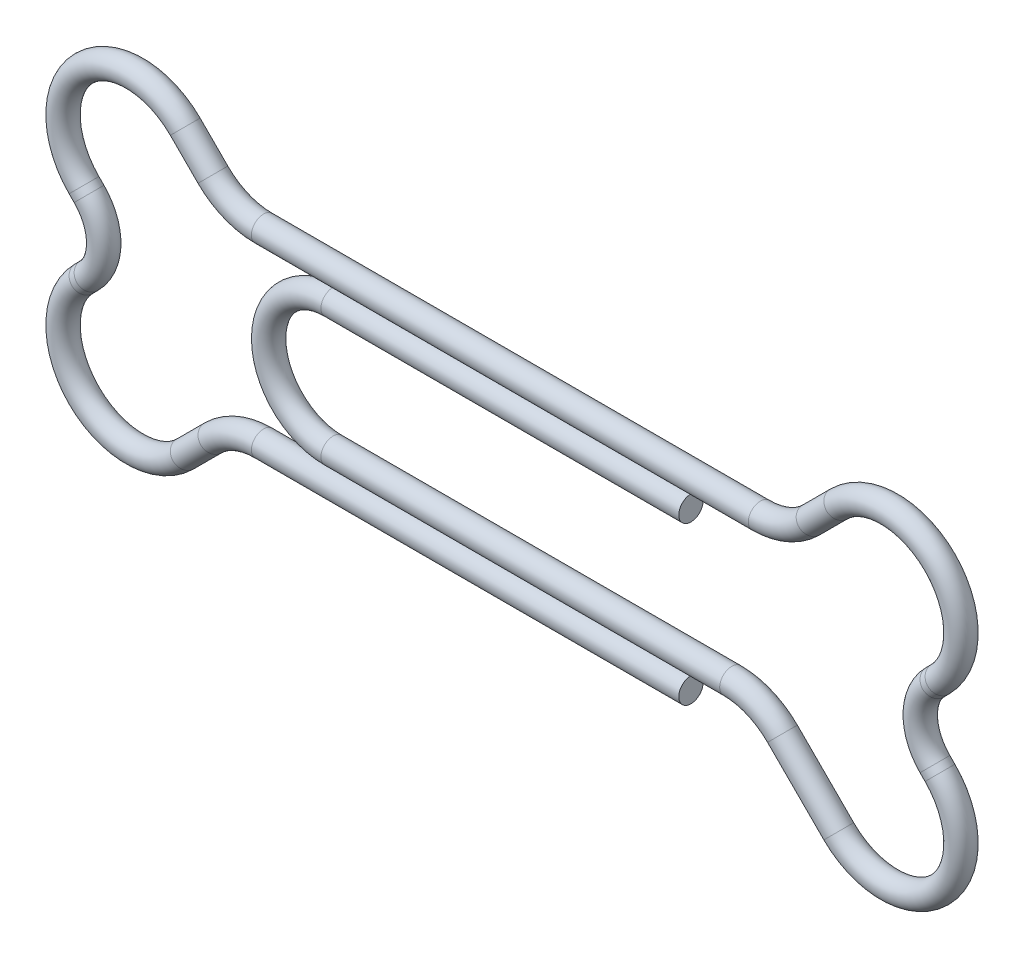
ISO-10303-21;
HEADER;
FILE_DESCRIPTION(('STEP AP214'),'2;1');
FILE_NAME('part.step','',(''),(''),'','','');
FILE_SCHEMA(('AUTOMOTIVE_DESIGN { 1 0 10303 214 1 1 1 1 }'));
ENDSEC;
DATA;
#1=APPLICATION_CONTEXT('core data for automotive mechanical design processes');
#2=APPLICATION_PROTOCOL_DEFINITION('international standard','automotive_design',2000,#1);
#3=PRODUCT_CONTEXT('',#1,'mechanical');
#4=PRODUCT('Part','Part','',(#3));
#5=PRODUCT_RELATED_PRODUCT_CATEGORY('part','',(#4));
#6=PRODUCT_DEFINITION_FORMATION('','',#4);
#7=PRODUCT_DEFINITION_CONTEXT('part definition',#1,'design');
#8=PRODUCT_DEFINITION('design','',#6,#7);
#9=PRODUCT_DEFINITION_SHAPE('','',#8);
#10=(LENGTH_UNIT() NAMED_UNIT(*) SI_UNIT(.MILLI.,.METRE.));
#11=(NAMED_UNIT(*) PLANE_ANGLE_UNIT() SI_UNIT($,.RADIAN.));
#12=(NAMED_UNIT(*) SI_UNIT($,.STERADIAN.) SOLID_ANGLE_UNIT());
#13=UNCERTAINTY_MEASURE_WITH_UNIT(LENGTH_MEASURE(1.E-05),#10,'distance_accuracy_value','');
#14=(GEOMETRIC_REPRESENTATION_CONTEXT(3) GLOBAL_UNCERTAINTY_ASSIGNED_CONTEXT((#13)) GLOBAL_UNIT_ASSIGNED_CONTEXT((#10,
#11,#12)) REPRESENTATION_CONTEXT('',''));
#15=CARTESIAN_POINT('',(0.,0.,0.));
#16=DIRECTION('',(0.,0.,1.));
#17=DIRECTION('',(1.,0.,0.));
#18=AXIS2_PLACEMENT_3D('',#15,#16,#17);
#19=CARTESIAN_POINT('',(1.52104574826343E-13,4.49999999999999,0.));
#20=DIRECTION('',(1.,0.,0.));
#21=DIRECTION('',(0.,0.,-1.));
#22=AXIS2_PLACEMENT_3D('',#19,#20,#21);
#23=CYLINDRICAL_SURFACE('',#22,0.85);
#24=CARTESIAN_POINT('',(1.52104574826343E-13,4.49999999999999,0.));
#25=DIRECTION('',(-1.,0.,0.));
#26=DIRECTION('',(0.,-1.,0.));
#27=AXIS2_PLACEMENT_3D('',#24,#25,#26);
#28=CIRCLE('',#27,0.85);
#29=CARTESIAN_POINT('',(1.80835438960207E-13,5.34999999999999,0.));
#30=VERTEX_POINT('',#29);
#31=EDGE_CURVE('E39',#30,#30,#28,.T.);
#32=ORIENTED_EDGE('',*,*,#31,.F.);
#33=EDGE_LOOP('',(#32));
#34=FACE_BOUND('',#33,.T.);
#35=CARTESIAN_POINT('',(25.0000000000001,4.49999999999999,0.));
#36=DIRECTION('',(-1.,0.,0.));
#37=DIRECTION('',(0.,-1.,0.));
#38=AXIS2_PLACEMENT_3D('',#35,#36,#37);
#39=CIRCLE('',#38,0.85);
#40=CARTESIAN_POINT('',(25.0000000000002,3.64999999999999,0.));
#41=VERTEX_POINT('',#40);
#42=EDGE_CURVE('E10',#41,#41,#39,.T.);
#43=ORIENTED_EDGE('',*,*,#42,.T.);
#44=EDGE_LOOP('',(#43));
#45=FACE_BOUND('',#44,.T.);
#46=ADVANCED_FACE('F33',(#34,#45),#23,.T.);
#47=CARTESIAN_POINT('',(0.,0.,0.));
#48=DIRECTION('',(0.,0.,-1.));
#49=DIRECTION('',(-1.,0.,0.));
#50=AXIS2_PLACEMENT_3D('',#47,#48,#49);
#51=TOROIDAL_SURFACE('',#50,4.49999999999999,0.85);
#52=CARTESIAN_POINT('',(-1.52655665885959E-13,-4.49999999999999,0.));
#53=DIRECTION('',(1.,0.,0.));
#54=DIRECTION('',(0.,1.,0.));
#55=AXIS2_PLACEMENT_3D('',#52,#53,#54);
#56=CIRCLE('',#55,0.85);
#57=CARTESIAN_POINT('',(-1.81490624997751E-13,-5.34999999999999,0.));
#58=VERTEX_POINT('',#57);
#59=EDGE_CURVE('E43',#58,#58,#56,.T.);
#60=CARTESIAN_POINT('',(0.,0.,0.));
#61=DIRECTION('',(0.,0.,-1.));
#62=DIRECTION('',(-1.,0.,0.));
#63=AXIS2_PLACEMENT_3D('',#60,#61,#62);
#64=CIRCLE('',#63,5.34999999999999);
#65=EDGE_CURVE('',#58,#30,#64,.T.);
#66=ORIENTED_EDGE('',*,*,#59,.F.);
#67=ORIENTED_EDGE('',*,*,#31,.T.);
#68=ORIENTED_EDGE('',*,*,#65,.T.);
#69=ORIENTED_EDGE('',*,*,#65,.F.);
#70=EDGE_LOOP('',(#66,#68,#67,#69));
#71=FACE_BOUND('',#70,.T.);
#72=ADVANCED_FACE('F233',(#71),#51,.T.);
#73=CARTESIAN_POINT('',(27.8578643762689,-4.49999999999999,0.));
#74=DIRECTION('',(-1.,0.,0.));
#75=DIRECTION('',(0.,0.,1.));
#76=AXIS2_PLACEMENT_3D('',#73,#74,#75);
#77=CYLINDRICAL_SURFACE('',#76,0.85);
#78=CARTESIAN_POINT('',(27.8578643762689,-4.49999999999999,0.));
#79=DIRECTION('',(1.,0.,0.));
#80=DIRECTION('',(0.,1.,0.));
#81=AXIS2_PLACEMENT_3D('',#78,#79,#80);
#82=CIRCLE('',#81,0.85);
#83=CARTESIAN_POINT('',(27.8578643762688,-3.65,0.));
#84=VERTEX_POINT('',#83);
#85=EDGE_CURVE('E47',#84,#84,#82,.T.);
#86=ORIENTED_EDGE('',*,*,#85,.F.);
#87=EDGE_LOOP('',(#86));
#88=FACE_BOUND('',#87,.T.);
#89=ORIENTED_EDGE('',*,*,#59,.T.);
#90=EDGE_LOOP('',(#89));
#91=FACE_BOUND('',#90,.T.);
#92=ADVANCED_FACE('F227',(#88,#91),#77,.T.);
#93=CARTESIAN_POINT('',(27.857864376269,-9.5,0.));
#94=DIRECTION('',(0.,0.,1.));
#95=DIRECTION('',(1.,0.,0.));
#96=AXIS2_PLACEMENT_3D('',#93,#94,#95);
#97=TOROIDAL_SURFACE('',#96,5.,0.85);
#98=CARTESIAN_POINT('',(31.3933982822017,-5.96446609406717,0.));
#99=DIRECTION('',(0.707106781186563,-0.707106781186532,0.));
#100=DIRECTION('',(0.707106781186532,0.707106781186563,0.));
#101=AXIS2_PLACEMENT_3D('',#98,#99,#100);
#102=CIRCLE('',#101,0.85);
#103=CARTESIAN_POINT('',(31.9944390462102,-5.36342533005859,0.));
#104=VERTEX_POINT('',#103);
#105=EDGE_CURVE('E52',#104,#104,#102,.T.);
#106=CARTESIAN_POINT('',(27.857864376269,-9.5,0.));
#107=DIRECTION('',(0.,0.,1.));
#108=DIRECTION('',(1.,0.,0.));
#109=AXIS2_PLACEMENT_3D('',#106,#107,#108);
#110=CIRCLE('',#109,5.85);
#111=EDGE_CURVE('',#104,#84,#110,.T.);
#112=ORIENTED_EDGE('',*,*,#105,.F.);
#113=ORIENTED_EDGE('',*,*,#85,.T.);
#114=ORIENTED_EDGE('',*,*,#111,.T.);
#115=ORIENTED_EDGE('',*,*,#111,.F.);
#116=EDGE_LOOP('',(#112,#114,#113,#115));
#117=FACE_BOUND('',#116,.T.);
#118=ADVANCED_FACE('F221',(#117),#97,.T.);
#119=CARTESIAN_POINT('',(35.3284271247461,-9.89949493661157,0.));
#120=DIRECTION('',(-0.707106781186547,0.707106781186548,0.));
#121=DIRECTION('',(-0.707106781186548,-0.707106781186547,0.));
#122=AXIS2_PLACEMENT_3D('',#119,#120,#121);
#123=CYLINDRICAL_SURFACE('',#122,0.85);
#124=CARTESIAN_POINT('',(35.3284271247461,-9.89949493661157,0.));
#125=DIRECTION('',(0.707106781186563,-0.707106781186532,0.));
#126=DIRECTION('',(0.707106781186532,0.707106781186563,0.));
#127=AXIS2_PLACEMENT_3D('',#124,#125,#126);
#128=CIRCLE('',#127,0.85);
#129=CARTESIAN_POINT('',(34.7273863607375,-10.5005357006201,0.));
#130=VERTEX_POINT('',#129);
#131=EDGE_CURVE('E55',#130,#130,#128,.T.);
#132=ORIENTED_EDGE('',*,*,#131,.F.);
#133=EDGE_LOOP('',(#132));
#134=FACE_BOUND('',#133,.T.);
#135=ORIENTED_EDGE('',*,*,#105,.T.);
#136=EDGE_LOOP('',(#135));
#137=FACE_BOUND('',#136,.T.);
#138=ADVANCED_FACE('F215',(#134,#137),#123,.T.);
#139=CARTESIAN_POINT('',(38.8639610306789,-6.36396103067894,0.));
#140=DIRECTION('',(0.,0.,-1.));
#141=DIRECTION('',(-1.,0.,0.));
#142=AXIS2_PLACEMENT_3D('',#139,#140,#141);
#143=TOROIDAL_SURFACE('',#142,4.99999999999999,0.85);
#144=CARTESIAN_POINT('',(42.3994949366118,-2.82842712474632,0.));
#145=DIRECTION('',(-0.707106781186563,0.707106781186532,0.));
#146=DIRECTION('',(-0.707106781186532,-0.707106781186563,0.));
#147=AXIS2_PLACEMENT_3D('',#144,#145,#146);
#148=CIRCLE('',#147,0.85);
#149=CARTESIAN_POINT('',(43.0005357006203,-2.22738636073777,0.));
#150=VERTEX_POINT('',#149);
#151=EDGE_CURVE('E58',#150,#150,#148,.T.);
#152=CARTESIAN_POINT('',(38.8639610306789,-6.36396103067894,0.));
#153=DIRECTION('',(0.,0.,-1.));
#154=DIRECTION('',(-1.,0.,0.));
#155=AXIS2_PLACEMENT_3D('',#152,#153,#154);
#156=CIRCLE('',#155,5.84999999999999);
#157=EDGE_CURVE('',#150,#130,#156,.T.);
#158=ORIENTED_EDGE('',*,*,#151,.F.);
#159=ORIENTED_EDGE('',*,*,#131,.T.);
#160=ORIENTED_EDGE('',*,*,#157,.T.);
#161=ORIENTED_EDGE('',*,*,#157,.F.);
#162=EDGE_LOOP('',(#158,#160,#159,#161));
#163=FACE_BOUND('',#162,.T.);
#164=ADVANCED_FACE('F209',(#163),#143,.T.);
#165=CARTESIAN_POINT('',(42.0459415460185,-2.47487373415304,0.));
#166=DIRECTION('',(0.70710678118655,-0.707106781186545,0.));
#167=DIRECTION('',(0.707106781186545,0.70710678118655,0.));
#168=AXIS2_PLACEMENT_3D('',#165,#166,#167);
#169=CYLINDRICAL_SURFACE('',#168,0.85);
#170=CARTESIAN_POINT('',(42.0459415460185,-2.47487373415304,0.));
#171=DIRECTION('',(-0.707106781186563,0.707106781186532,0.));
#172=DIRECTION('',(-0.707106781186532,-0.707106781186563,0.));
#173=AXIS2_PLACEMENT_3D('',#170,#171,#172);
#174=CIRCLE('',#173,0.85);
#175=CARTESIAN_POINT('',(41.44490078201,-3.07591449816164,0.));
#176=VERTEX_POINT('',#175);
#177=EDGE_CURVE('E61',#176,#176,#174,.T.);
#178=ORIENTED_EDGE('',*,*,#177,.F.);
#179=EDGE_LOOP('',(#178));
#180=FACE_BOUND('',#179,.T.);
#181=ORIENTED_EDGE('',*,*,#151,.T.);
#182=EDGE_LOOP('',(#181));
#183=FACE_BOUND('',#182,.T.);
#184=ADVANCED_FACE('F203',(#180,#183),#169,.T.);
#185=CARTESIAN_POINT('',(44.5208152801713,0.,0.));
#186=DIRECTION('',(0.,0.,1.));
#187=DIRECTION('',(1.,0.,0.));
#188=AXIS2_PLACEMENT_3D('',#185,#186,#187);
#189=TOROIDAL_SURFACE('',#188,3.5,0.85);
#190=CARTESIAN_POINT('',(42.0459415460183,2.47487373415283,0.));
#191=DIRECTION('',(0.707106781186542,0.707106781186553,0.));
#192=DIRECTION('',(-0.707106781186553,0.707106781186542,0.));
#193=AXIS2_PLACEMENT_3D('',#190,#191,#192);
#194=CIRCLE('',#193,0.85);
#195=CARTESIAN_POINT('',(41.4449007820097,3.07591449816138,0.));
#196=VERTEX_POINT('',#195);
#197=EDGE_CURVE('E64',#196,#196,#194,.T.);
#198=CARTESIAN_POINT('',(44.5208152801713,0.,0.));
#199=DIRECTION('',(0.,0.,1.));
#200=DIRECTION('',(1.,0.,0.));
#201=AXIS2_PLACEMENT_3D('',#198,#199,#200);
#202=CIRCLE('',#201,4.35);
#203=EDGE_CURVE('',#196,#176,#202,.T.);
#204=ORIENTED_EDGE('',*,*,#197,.F.);
#205=ORIENTED_EDGE('',*,*,#177,.T.);
#206=ORIENTED_EDGE('',*,*,#203,.T.);
#207=ORIENTED_EDGE('',*,*,#203,.F.);
#208=EDGE_LOOP('',(#204,#206,#205,#207));
#209=FACE_BOUND('',#208,.T.);
#210=ADVANCED_FACE('F197',(#209),#189,.T.);
#211=CARTESIAN_POINT('',(42.3994949366116,2.82842712474611,0.));
#212=DIRECTION('',(-0.707106781186547,-0.707106781186548,0.));
#213=DIRECTION('',(0.707106781186548,-0.707106781186547,0.));
#214=AXIS2_PLACEMENT_3D('',#211,#212,#213);
#215=CYLINDRICAL_SURFACE('',#214,0.85);
#216=CARTESIAN_POINT('',(42.3994949366116,2.82842712474611,0.));
#217=DIRECTION('',(0.707106781186542,0.707106781186553,0.));
#218=DIRECTION('',(-0.707106781186553,0.707106781186542,0.));
#219=AXIS2_PLACEMENT_3D('',#216,#217,#218);
#220=CIRCLE('',#219,0.85);
#221=CARTESIAN_POINT('',(43.0005357006201,2.22738636073753,0.));
#222=VERTEX_POINT('',#221);
#223=EDGE_CURVE('E67',#222,#222,#220,.T.);
#224=ORIENTED_EDGE('',*,*,#223,.F.);
#225=EDGE_LOOP('',(#224));
#226=FACE_BOUND('',#225,.T.);
#227=ORIENTED_EDGE('',*,*,#197,.T.);
#228=EDGE_LOOP('',(#227));
#229=FACE_BOUND('',#228,.T.);
#230=ADVANCED_FACE('F191',(#226,#229),#215,.T.);
#231=CARTESIAN_POINT('',(38.8639610306789,6.36396103067895,0.));
#232=DIRECTION('',(0.,0.,-1.));
#233=DIRECTION('',(-1.,0.,0.));
#234=AXIS2_PLACEMENT_3D('',#231,#232,#233);
#235=TOROIDAL_SURFACE('',#234,5.,0.85);
#236=CARTESIAN_POINT('',(35.3284271247462,9.89949493661173,0.));
#237=DIRECTION('',(-0.707106781186532,-0.707106781186563,0.));
#238=DIRECTION('',(0.707106781186563,-0.707106781186532,0.));
#239=AXIS2_PLACEMENT_3D('',#236,#237,#238);
#240=CIRCLE('',#239,0.85);
#241=CARTESIAN_POINT('',(34.7273863607377,10.5005357006203,0.));
#242=VERTEX_POINT('',#241);
#243=EDGE_CURVE('E70',#242,#242,#240,.T.);
#244=CARTESIAN_POINT('',(38.8639610306789,6.36396103067895,0.));
#245=DIRECTION('',(0.,0.,-1.));
#246=DIRECTION('',(-1.,0.,0.));
#247=AXIS2_PLACEMENT_3D('',#244,#245,#246);
#248=CIRCLE('',#247,5.85);
#249=EDGE_CURVE('',#242,#222,#248,.T.);
#250=ORIENTED_EDGE('',*,*,#243,.F.);
#251=ORIENTED_EDGE('',*,*,#223,.T.);
#252=ORIENTED_EDGE('',*,*,#249,.T.);
#253=ORIENTED_EDGE('',*,*,#249,.F.);
#254=EDGE_LOOP('',(#250,#252,#251,#253));
#255=FACE_BOUND('',#254,.T.);
#256=ADVANCED_FACE('F185',(#255),#235,.T.);
#257=CARTESIAN_POINT('',(33.3933982822018,7.96446609406734,0.));
#258=DIRECTION('',(0.707106781186545,0.70710678118655,0.));
#259=DIRECTION('',(-0.70710678118655,0.707106781186545,0.));
#260=AXIS2_PLACEMENT_3D('',#257,#258,#259);
#261=CYLINDRICAL_SURFACE('',#260,0.85);
#262=CARTESIAN_POINT('',(33.3933982822018,7.96446609406734,0.));
#263=DIRECTION('',(-0.707106781186532,-0.707106781186563,0.));
#264=DIRECTION('',(0.707106781186563,-0.707106781186532,0.));
#265=AXIS2_PLACEMENT_3D('',#262,#263,#264);
#266=CIRCLE('',#265,0.85);
#267=CARTESIAN_POINT('',(33.9944390462104,7.36342533005879,0.));
#268=VERTEX_POINT('',#267);
#269=EDGE_CURVE('E73',#268,#268,#266,.T.);
#270=ORIENTED_EDGE('',*,*,#269,.F.);
#271=EDGE_LOOP('',(#270));
#272=FACE_BOUND('',#271,.T.);
#273=ORIENTED_EDGE('',*,*,#243,.T.);
#274=EDGE_LOOP('',(#273));
#275=FACE_BOUND('',#274,.T.);
#276=ADVANCED_FACE('F179',(#272,#275),#261,.T.);
#277=CARTESIAN_POINT('',(29.857864376269,11.5,0.));
#278=DIRECTION('',(0.,0.,1.));
#279=DIRECTION('',(1.,0.,0.));
#280=AXIS2_PLACEMENT_3D('',#277,#278,#279);
#281=TOROIDAL_SURFACE('',#280,5.,0.85);
#282=CARTESIAN_POINT('',(29.8578643762691,6.5,0.));
#283=DIRECTION('',(-1.,0.,0.));
#284=DIRECTION('',(0.,-1.,0.));
#285=AXIS2_PLACEMENT_3D('',#282,#283,#284);
#286=CIRCLE('',#285,0.85);
#287=CARTESIAN_POINT('',(29.8578643762691,5.65,0.));
#288=VERTEX_POINT('',#287);
#289=EDGE_CURVE('E76',#288,#288,#286,.T.);
#290=CARTESIAN_POINT('',(29.857864376269,11.5,0.));
#291=DIRECTION('',(0.,0.,1.));
#292=DIRECTION('',(1.,0.,0.));
#293=AXIS2_PLACEMENT_3D('',#290,#291,#292);
#294=CIRCLE('',#293,5.85);
#295=EDGE_CURVE('',#288,#268,#294,.T.);
#296=ORIENTED_EDGE('',*,*,#289,.F.);
#297=ORIENTED_EDGE('',*,*,#269,.T.);
#298=ORIENTED_EDGE('',*,*,#295,.T.);
#299=ORIENTED_EDGE('',*,*,#295,.F.);
#300=EDGE_LOOP('',(#296,#298,#297,#299));
#301=FACE_BOUND('',#300,.T.);
#302=ADVANCED_FACE('F173',(#301),#281,.T.);
#303=CARTESIAN_POINT('',(-4.85786437626894,6.49999999999999,0.));
#304=DIRECTION('',(1.,0.,0.));
#305=DIRECTION('',(0.,1.,0.));
#306=AXIS2_PLACEMENT_3D('',#303,#304,#305);
#307=CYLINDRICAL_SURFACE('',#306,0.85);
#308=CARTESIAN_POINT('',(-4.85786437626894,6.49999999999999,0.));
#309=DIRECTION('',(-1.,0.,0.));
#310=DIRECTION('',(0.,-1.,0.));
#311=AXIS2_PLACEMENT_3D('',#308,#309,#310);
#312=CIRCLE('',#311,0.85);
#313=CARTESIAN_POINT('',(-4.85786437626893,5.64999999999999,0.));
#314=VERTEX_POINT('',#313);
#315=EDGE_CURVE('E79',#314,#314,#312,.T.);
#316=ORIENTED_EDGE('',*,*,#315,.F.);
#317=EDGE_LOOP('',(#316));
#318=FACE_BOUND('',#317,.T.);
#319=ORIENTED_EDGE('',*,*,#289,.T.);
#320=EDGE_LOOP('',(#319));
#321=FACE_BOUND('',#320,.T.);
#322=ADVANCED_FACE('F167',(#318,#321),#307,.T.);
#323=CARTESIAN_POINT('',(-4.85786437626901,11.5,0.));
#324=DIRECTION('',(0.,0.,1.));
#325=DIRECTION('',(1.,0.,0.));
#326=AXIS2_PLACEMENT_3D('',#323,#324,#325);
#327=TOROIDAL_SURFACE('',#326,5.,0.85);
#328=CARTESIAN_POINT('',(-8.39339828220171,7.96446609406722,0.));
#329=DIRECTION('',(-0.707106781186553,0.707106781186542,0.));
#330=DIRECTION('',(-0.707106781186542,-0.707106781186553,0.));
#331=AXIS2_PLACEMENT_3D('',#328,#329,#330);
#332=CIRCLE('',#331,0.85);
#333=CARTESIAN_POINT('',(-8.99443904621027,7.36342533005865,0.));
#334=VERTEX_POINT('',#333);
#335=EDGE_CURVE('E82',#334,#334,#332,.T.);
#336=CARTESIAN_POINT('',(-4.85786437626901,11.5,0.));
#337=DIRECTION('',(0.,0.,1.));
#338=DIRECTION('',(1.,0.,0.));
#339=AXIS2_PLACEMENT_3D('',#336,#337,#338);
#340=CIRCLE('',#339,5.85);
#341=EDGE_CURVE('',#334,#314,#340,.T.);
#342=ORIENTED_EDGE('',*,*,#335,.F.);
#343=ORIENTED_EDGE('',*,*,#315,.T.);
#344=ORIENTED_EDGE('',*,*,#341,.T.);
#345=ORIENTED_EDGE('',*,*,#341,.F.);
#346=EDGE_LOOP('',(#342,#344,#343,#345));
#347=FACE_BOUND('',#346,.T.);
#348=ADVANCED_FACE('F161',(#347),#327,.T.);
#349=CARTESIAN_POINT('',(-10.3284271247461,9.89949493661163,0.));
#350=DIRECTION('',(0.707106781186546,-0.707106781186549,0.));
#351=DIRECTION('',(0.707106781186549,0.707106781186546,0.));
#352=AXIS2_PLACEMENT_3D('',#349,#350,#351);
#353=CYLINDRICAL_SURFACE('',#352,0.85);
#354=CARTESIAN_POINT('',(-10.3284271247461,9.89949493661163,0.));
#355=DIRECTION('',(-0.707106781186553,0.707106781186542,0.));
#356=DIRECTION('',(-0.707106781186542,-0.707106781186553,0.));
#357=AXIS2_PLACEMENT_3D('',#354,#355,#356);
#358=CIRCLE('',#357,0.85);
#359=CARTESIAN_POINT('',(-9.72738636073754,10.5005357006202,0.));
#360=VERTEX_POINT('',#359);
#361=EDGE_CURVE('E85',#360,#360,#358,.T.);
#362=ORIENTED_EDGE('',*,*,#361,.F.);
#363=EDGE_LOOP('',(#362));
#364=FACE_BOUND('',#363,.T.);
#365=ORIENTED_EDGE('',*,*,#335,.T.);
#366=EDGE_LOOP('',(#365));
#367=FACE_BOUND('',#366,.T.);
#368=ADVANCED_FACE('F155',(#364,#367),#353,.T.);
#369=CARTESIAN_POINT('',(-13.8639610306789,6.36396103067895,0.));
#370=DIRECTION('',(0.,0.,-1.));
#371=DIRECTION('',(-1.,0.,0.));
#372=AXIS2_PLACEMENT_3D('',#369,#370,#371);
#373=TOROIDAL_SURFACE('',#372,5.,0.85);
#374=CARTESIAN_POINT('',(-17.3994949366116,2.82842712474621,0.));
#375=DIRECTION('',(0.707106781186565,-0.70710678118653,0.));
#376=DIRECTION('',(0.70710678118653,0.707106781186565,0.));
#377=AXIS2_PLACEMENT_3D('',#374,#375,#376);
#378=CIRCLE('',#377,0.85);
#379=CARTESIAN_POINT('',(-18.0005357006202,2.22738636073765,0.));
#380=VERTEX_POINT('',#379);
#381=EDGE_CURVE('E88',#380,#380,#378,.T.);
#382=CARTESIAN_POINT('',(-13.8639610306789,6.36396103067895,0.));
#383=DIRECTION('',(0.,0.,-1.));
#384=DIRECTION('',(-1.,0.,0.));
#385=AXIS2_PLACEMENT_3D('',#382,#383,#384);
#386=CIRCLE('',#385,5.85);
#387=EDGE_CURVE('',#380,#360,#386,.T.);
#388=ORIENTED_EDGE('',*,*,#381,.F.);
#389=ORIENTED_EDGE('',*,*,#361,.T.);
#390=ORIENTED_EDGE('',*,*,#387,.T.);
#391=ORIENTED_EDGE('',*,*,#387,.F.);
#392=EDGE_LOOP('',(#388,#390,#389,#391));
#393=FACE_BOUND('',#392,.T.);
#394=ADVANCED_FACE('F149',(#393),#373,.T.);
#395=CARTESIAN_POINT('',(-17.0459415460184,2.47487373415293,0.));
#396=DIRECTION('',(-0.707106781186548,0.707106781186547,0.));
#397=DIRECTION('',(-0.707106781186547,-0.707106781186548,0.));
#398=AXIS2_PLACEMENT_3D('',#395,#396,#397);
#399=CYLINDRICAL_SURFACE('',#398,0.85);
#400=CARTESIAN_POINT('',(-17.0459415460184,2.47487373415293,0.));
#401=DIRECTION('',(0.707106781186565,-0.70710678118653,0.));
#402=DIRECTION('',(0.70710678118653,0.707106781186565,0.));
#403=AXIS2_PLACEMENT_3D('',#400,#401,#402);
#404=CIRCLE('',#403,0.85);
#405=CARTESIAN_POINT('',(-16.4449007820098,3.0759144981615,0.));
#406=VERTEX_POINT('',#405);
#407=EDGE_CURVE('E91',#406,#406,#404,.T.);
#408=ORIENTED_EDGE('',*,*,#407,.F.);
#409=EDGE_LOOP('',(#408));
#410=FACE_BOUND('',#409,.T.);
#411=ORIENTED_EDGE('',*,*,#381,.T.);
#412=EDGE_LOOP('',(#411));
#413=FACE_BOUND('',#412,.T.);
#414=ADVANCED_FACE('F143',(#410,#413),#399,.T.);
#415=CARTESIAN_POINT('',(-19.5208152801713,0.,0.));
#416=DIRECTION('',(0.,0.,1.));
#417=DIRECTION('',(1.,0.,0.));
#418=AXIS2_PLACEMENT_3D('',#415,#416,#417);
#419=TOROIDAL_SURFACE('',#418,3.5,0.85);
#420=CARTESIAN_POINT('',(-17.0459415460184,-2.47487373415293,0.));
#421=DIRECTION('',(-0.707106781186539,-0.707106781186556,0.));
#422=DIRECTION('',(0.707106781186556,-0.707106781186539,0.));
#423=AXIS2_PLACEMENT_3D('',#420,#421,#422);
#424=CIRCLE('',#423,0.85);
#425=CARTESIAN_POINT('',(-16.4449007820098,-3.0759144981615,0.));
#426=VERTEX_POINT('',#425);
#427=EDGE_CURVE('E94',#426,#426,#424,.T.);
#428=CARTESIAN_POINT('',(-19.5208152801713,0.,0.));
#429=DIRECTION('',(0.,0.,1.));
#430=DIRECTION('',(1.,0.,0.));
#431=AXIS2_PLACEMENT_3D('',#428,#429,#430);
#432=CIRCLE('',#431,4.35);
#433=EDGE_CURVE('',#426,#406,#432,.T.);
#434=ORIENTED_EDGE('',*,*,#427,.F.);
#435=ORIENTED_EDGE('',*,*,#407,.T.);
#436=ORIENTED_EDGE('',*,*,#433,.T.);
#437=ORIENTED_EDGE('',*,*,#433,.F.);
#438=EDGE_LOOP('',(#434,#436,#435,#437));
#439=FACE_BOUND('',#438,.T.);
#440=ADVANCED_FACE('F137',(#439),#419,.T.);
#441=CARTESIAN_POINT('',(-17.3994949366116,-2.82842712474621,0.));
#442=DIRECTION('',(0.707106781186547,0.707106781186548,0.));
#443=DIRECTION('',(-0.707106781186548,0.707106781186547,0.));
#444=AXIS2_PLACEMENT_3D('',#441,#442,#443);
#445=CYLINDRICAL_SURFACE('',#444,0.85);
#446=CARTESIAN_POINT('',(-17.3994949366116,-2.82842712474621,0.));
#447=DIRECTION('',(-0.707106781186539,-0.707106781186556,0.));
#448=DIRECTION('',(0.707106781186556,-0.707106781186539,0.));
#449=AXIS2_PLACEMENT_3D('',#446,#447,#448);
#450=CIRCLE('',#449,0.85);
#451=CARTESIAN_POINT('',(-18.0005357006202,-2.22738636073765,0.));
#452=VERTEX_POINT('',#451);
#453=EDGE_CURVE('E97',#452,#452,#450,.T.);
#454=ORIENTED_EDGE('',*,*,#453,.F.);
#455=EDGE_LOOP('',(#454));
#456=FACE_BOUND('',#455,.T.);
#457=ORIENTED_EDGE('',*,*,#427,.T.);
#458=EDGE_LOOP('',(#457));
#459=FACE_BOUND('',#458,.T.);
#460=ADVANCED_FACE('F131',(#456,#459),#445,.T.);
#461=CARTESIAN_POINT('',(-13.8639610306789,-6.36396103067895,0.));
#462=DIRECTION('',(0.,0.,-1.));
#463=DIRECTION('',(-1.,0.,0.));
#464=AXIS2_PLACEMENT_3D('',#461,#462,#463);
#465=TOROIDAL_SURFACE('',#464,5.,0.85);
#466=CARTESIAN_POINT('',(-10.3284271247462,-9.89949493661168,0.));
#467=DIRECTION('',(0.70710678118654,0.707106781186555,0.));
#468=DIRECTION('',(-0.707106781186555,0.70710678118654,0.));
#469=AXIS2_PLACEMENT_3D('',#466,#467,#468);
#470=CIRCLE('',#469,0.85);
#471=CARTESIAN_POINT('',(-9.72738636073759,-10.5005357006202,0.));
#472=VERTEX_POINT('',#471);
#473=EDGE_CURVE('E100',#472,#472,#470,.T.);
#474=CARTESIAN_POINT('',(-13.8639610306789,-6.36396103067895,0.));
#475=DIRECTION('',(0.,0.,-1.));
#476=DIRECTION('',(-1.,0.,0.));
#477=AXIS2_PLACEMENT_3D('',#474,#475,#476);
#478=CIRCLE('',#477,5.85);
#479=EDGE_CURVE('',#472,#452,#478,.T.);
#480=ORIENTED_EDGE('',*,*,#473,.F.);
#481=ORIENTED_EDGE('',*,*,#453,.T.);
#482=ORIENTED_EDGE('',*,*,#479,.T.);
#483=ORIENTED_EDGE('',*,*,#479,.F.);
#484=EDGE_LOOP('',(#480,#482,#481,#483));
#485=FACE_BOUND('',#484,.T.);
#486=ADVANCED_FACE('F125',(#485),#465,.T.);
#487=CARTESIAN_POINT('',(-8.39339828220178,-7.96446609406729,0.));
#488=DIRECTION('',(-0.707106781186546,-0.707106781186549,0.));
#489=DIRECTION('',(0.707106781186549,-0.707106781186546,0.));
#490=AXIS2_PLACEMENT_3D('',#487,#488,#489);
#491=CYLINDRICAL_SURFACE('',#490,0.85);
#492=CARTESIAN_POINT('',(-8.39339828220178,-7.96446609406729,0.));
#493=DIRECTION('',(0.70710678118654,0.707106781186555,0.));
#494=DIRECTION('',(-0.707106781186555,0.70710678118654,0.));
#495=AXIS2_PLACEMENT_3D('',#492,#493,#494);
#496=CIRCLE('',#495,0.85);
#497=CARTESIAN_POINT('',(-8.99443904621035,-7.36342533005873,0.));
#498=VERTEX_POINT('',#497);
#499=EDGE_CURVE('E103',#498,#498,#496,.T.);
#500=ORIENTED_EDGE('',*,*,#499,.F.);
#501=EDGE_LOOP('',(#500));
#502=FACE_BOUND('',#501,.T.);
#503=ORIENTED_EDGE('',*,*,#473,.T.);
#504=EDGE_LOOP('',(#503));
#505=FACE_BOUND('',#504,.T.);
#506=ADVANCED_FACE('F119',(#502,#505),#491,.T.);
#507=CARTESIAN_POINT('',(-4.85786437626902,-11.5,0.));
#508=DIRECTION('',(0.,0.,1.));
#509=DIRECTION('',(1.,0.,0.));
#510=AXIS2_PLACEMENT_3D('',#507,#508,#509);
#511=TOROIDAL_SURFACE('',#510,5.,0.85);
#512=CARTESIAN_POINT('',(-4.857864376269,-6.50000000000001,0.));
#513=DIRECTION('',(1.,0.,0.));
#514=DIRECTION('',(0.,1.,0.));
#515=AXIS2_PLACEMENT_3D('',#512,#513,#514);
#516=CIRCLE('',#515,0.85);
#517=CARTESIAN_POINT('',(-4.857864376269,-5.65000000000001,0.));
#518=VERTEX_POINT('',#517);
#519=EDGE_CURVE('E106',#518,#518,#516,.T.);
#520=CARTESIAN_POINT('',(-4.85786437626902,-11.5,0.));
#521=DIRECTION('',(0.,0.,1.));
#522=DIRECTION('',(1.,0.,0.));
#523=AXIS2_PLACEMENT_3D('',#520,#521,#522);
#524=CIRCLE('',#523,5.85);
#525=EDGE_CURVE('',#518,#498,#524,.T.);
#526=ORIENTED_EDGE('',*,*,#519,.F.);
#527=ORIENTED_EDGE('',*,*,#499,.T.);
#528=ORIENTED_EDGE('',*,*,#525,.T.);
#529=ORIENTED_EDGE('',*,*,#525,.F.);
#530=EDGE_LOOP('',(#526,#528,#527,#529));
#531=FACE_BOUND('',#530,.T.);
#532=ADVANCED_FACE('F116',(#531),#511,.T.);
#533=CARTESIAN_POINT('',(-4.857864376269,-6.50000000000001,0.));
#534=DIRECTION('',(1.,0.,0.));
#535=DIRECTION('',(0.,1.,0.));
#536=AXIS2_PLACEMENT_3D('',#533,#534,#535);
#537=CYLINDRICAL_SURFACE('',#536,0.85);
#538=ORIENTED_EDGE('',*,*,#519,.T.);
#539=EDGE_LOOP('',(#538));
#540=FACE_BOUND('',#539,.T.);
#541=CARTESIAN_POINT('',(25.,-6.5,0.));
#542=DIRECTION('',(1.,0.,0.));
#543=DIRECTION('',(0.,1.,0.));
#544=AXIS2_PLACEMENT_3D('',#541,#542,#543);
#545=CIRCLE('',#544,0.85);
#546=CARTESIAN_POINT('',(25.,-5.65,0.));
#547=VERTEX_POINT('',#546);
#548=EDGE_CURVE('E107',#547,#547,#545,.T.);
#549=ORIENTED_EDGE('',*,*,#548,.F.);
#550=EDGE_LOOP('',(#549));
#551=FACE_BOUND('',#550,.T.);
#552=ADVANCED_FACE('F113',(#540,#551),#537,.T.);
#553=CARTESIAN_POINT('',(25.0000000000001,4.49999999999999,0.));
#554=DIRECTION('',(-1.,0.,0.));
#555=DIRECTION('',(0.,-1.,0.));
#556=AXIS2_PLACEMENT_3D('',#553,#554,#555);
#557=PLANE('',#556);
#558=ORIENTED_EDGE('',*,*,#42,.F.);
#559=EDGE_LOOP('',(#558));
#560=FACE_BOUND('',#559,.T.);
#561=ADVANCED_FACE('F245',(#560),#557,.F.);
#562=CARTESIAN_POINT('',(25.,-6.5,0.));
#563=DIRECTION('',(1.,0.,0.));
#564=DIRECTION('',(0.,1.,0.));
#565=AXIS2_PLACEMENT_3D('',#562,#563,#564);
#566=PLANE('',#565);
#567=ORIENTED_EDGE('',*,*,#548,.T.);
#568=EDGE_LOOP('',(#567));
#569=FACE_BOUND('',#568,.T.);
#570=ADVANCED_FACE('F246',(#569),#566,.T.);
#571=CLOSED_SHELL('',(#46,#72,#92,#118,#138,#164,#184,#210,#230,#256,#276,#302,#322,#348,#368,
#394,#414,#440,#460,#486,#506,#532,#552,#561,#570));
#572=MANIFOLD_SOLID_BREP('B2',#571);
#573=ADVANCED_BREP_SHAPE_REPRESENTATION('',(#18,#572),#14);
#574=SHAPE_DEFINITION_REPRESENTATION(#9,#573);
ENDSEC;
END-ISO-10303-21;
